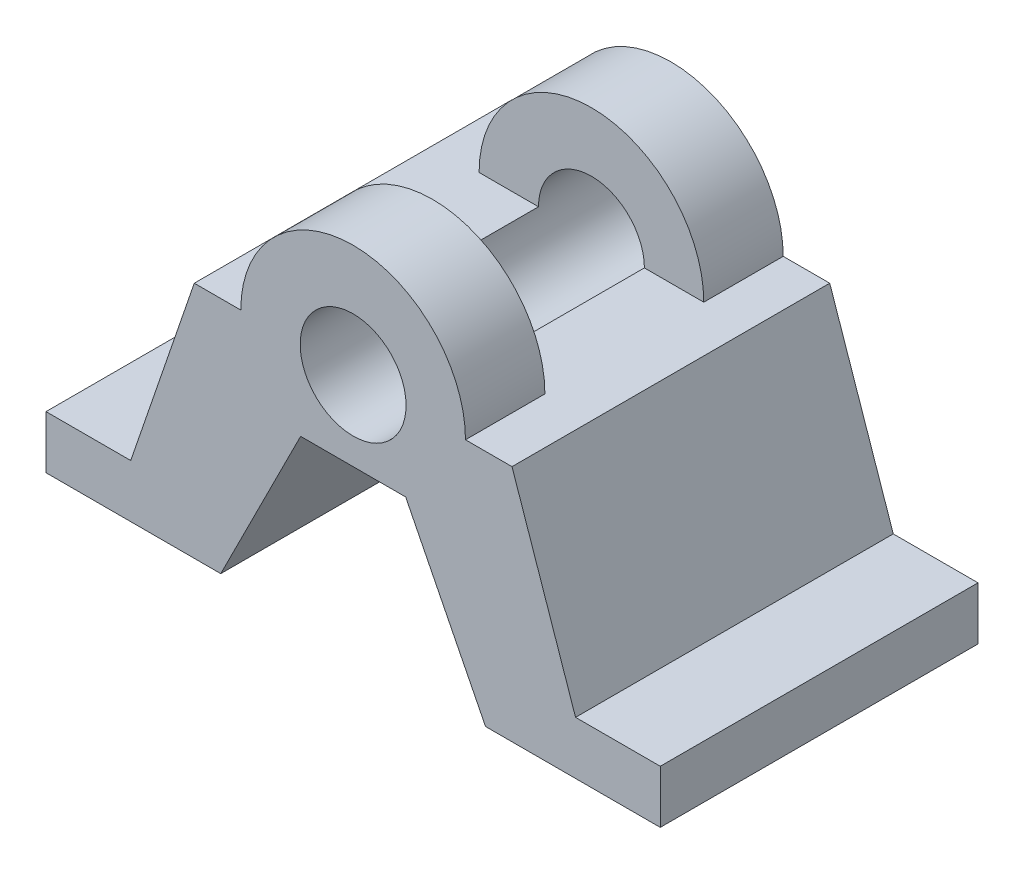
ISO-10303-21;
HEADER;
FILE_DESCRIPTION(('STEP AP214'),'2;1');
FILE_NAME('part.step','',(''),(''),'','','');
FILE_SCHEMA(('AUTOMOTIVE_DESIGN { 1 0 10303 214 1 1 1 1 }'));
ENDSEC;
DATA;
#1=APPLICATION_CONTEXT('core data for automotive mechanical design processes');
#2=APPLICATION_PROTOCOL_DEFINITION('international standard','automotive_design',2000,#1);
#3=PRODUCT_CONTEXT('',#1,'mechanical');
#4=PRODUCT('Part','Part','',(#3));
#5=PRODUCT_RELATED_PRODUCT_CATEGORY('part','',(#4));
#6=PRODUCT_DEFINITION_FORMATION('','',#4);
#7=PRODUCT_DEFINITION_CONTEXT('part definition',#1,'design');
#8=PRODUCT_DEFINITION('design','',#6,#7);
#9=PRODUCT_DEFINITION_SHAPE('','',#8);
#10=(LENGTH_UNIT() NAMED_UNIT(*) SI_UNIT(.MILLI.,.METRE.));
#11=(NAMED_UNIT(*) PLANE_ANGLE_UNIT() SI_UNIT($,.RADIAN.));
#12=(NAMED_UNIT(*) SI_UNIT($,.STERADIAN.) SOLID_ANGLE_UNIT());
#13=UNCERTAINTY_MEASURE_WITH_UNIT(LENGTH_MEASURE(1.E-05),#10,'distance_accuracy_value','');
#14=(GEOMETRIC_REPRESENTATION_CONTEXT(3) GLOBAL_UNCERTAINTY_ASSIGNED_CONTEXT((#13)) GLOBAL_UNIT_ASSIGNED_CONTEXT((#10,
#11,#12)) REPRESENTATION_CONTEXT('',''));
#15=CARTESIAN_POINT('',(0.,0.,0.));
#16=DIRECTION('',(0.,0.,1.));
#17=DIRECTION('',(1.,0.,0.));
#18=AXIS2_PLACEMENT_3D('',#15,#16,#17);
#19=CARTESIAN_POINT('',(-30.,45.,-60.));
#20=DIRECTION('',(0.,1.,0.));
#21=DIRECTION('',(0.,0.,1.));
#22=AXIS2_PLACEMENT_3D('',#19,#20,#21);
#23=PLANE('',#22);
#24=DIRECTION('',(-1.,0.,0.));
#25=VECTOR('',#24,1.);
#26=CARTESIAN_POINT('',(-30.,45.,-45.));
#27=LINE('',#26,#25);
#28=CARTESIAN_POINT('',(-10.,45.,-45.));
#29=VERTEX_POINT('',#28);
#30=CARTESIAN_POINT('',(-21.2145026831475,45.,-45.));
#31=VERTEX_POINT('',#30);
#32=EDGE_CURVE('E170',#29,#31,#27,.T.);
#33=ORIENTED_EDGE('',*,*,#32,.T.);
#34=DIRECTION('',(0.,0.,-1.));
#35=VECTOR('',#34,1.);
#36=CARTESIAN_POINT('',(-21.2145026831475,45.,-45.));
#37=LINE('',#36,#35);
#38=CARTESIAN_POINT('',(-21.2145026831475,45.,-60.));
#39=VERTEX_POINT('',#38);
#40=EDGE_CURVE('E309',#31,#39,#37,.T.);
#41=ORIENTED_EDGE('',*,*,#40,.T.);
#42=DIRECTION('',(-1.,0.,0.));
#43=VECTOR('',#42,1.);
#44=CARTESIAN_POINT('',(-30.,45.,-60.));
#45=LINE('',#44,#43);
#46=CARTESIAN_POINT('',(-30.,45.,-60.));
#47=VERTEX_POINT('',#46);
#48=EDGE_CURVE('E222',#39,#47,#45,.T.);
#49=ORIENTED_EDGE('',*,*,#48,.T.);
#50=DIRECTION('',(0.,0.,1.));
#51=VECTOR('',#50,1.);
#52=CARTESIAN_POINT('',(-30.,45.,-60.));
#53=LINE('',#52,#51);
#54=CARTESIAN_POINT('',(-30.,45.,0.));
#55=VERTEX_POINT('',#54);
#56=EDGE_CURVE('E277',#47,#55,#53,.T.);
#57=ORIENTED_EDGE('',*,*,#56,.T.);
#58=DIRECTION('',(-1.,0.,0.));
#59=VECTOR('',#58,1.);
#60=CARTESIAN_POINT('',(-30.,45.,0.));
#61=LINE('',#60,#59);
#62=CARTESIAN_POINT('',(-21.2145026831475,45.,0.));
#63=VERTEX_POINT('',#62);
#64=EDGE_CURVE('E259',#63,#55,#61,.T.);
#65=ORIENTED_EDGE('',*,*,#64,.F.);
#66=DIRECTION('',(0.,0.,1.));
#67=VECTOR('',#66,1.);
#68=CARTESIAN_POINT('',(-21.2145026831475,45.,-15.));
#69=LINE('',#68,#67);
#70=CARTESIAN_POINT('',(-21.2145026831475,45.,-15.));
#71=VERTEX_POINT('',#70);
#72=EDGE_CURVE('E194',#71,#63,#69,.T.);
#73=ORIENTED_EDGE('',*,*,#72,.F.);
#74=DIRECTION('',(1.,0.,0.));
#75=VECTOR('',#74,1.);
#76=CARTESIAN_POINT('',(-30.,45.,-15.));
#77=LINE('',#76,#75);
#78=CARTESIAN_POINT('',(-10.,45.,-15.));
#79=VERTEX_POINT('',#78);
#80=EDGE_CURVE('E181',#71,#79,#77,.T.);
#81=ORIENTED_EDGE('',*,*,#80,.T.);
#82=DIRECTION('',(0.,0.,1.));
#83=VECTOR('',#82,1.);
#84=CARTESIAN_POINT('',(-10.,45.,-60.));
#85=LINE('',#84,#83);
#86=EDGE_CURVE('E53',#29,#79,#85,.T.);
#87=ORIENTED_EDGE('',*,*,#86,.F.);
#88=EDGE_LOOP('',(#33,#41,#49,#57,#65,#73,#81,#87));
#89=FACE_BOUND('',#88,.T.);
#90=ADVANCED_FACE('F39',(#89),#23,.T.);
#91=CARTESIAN_POINT('',(30.,45.,-60.));
#92=VERTEX_POINT('',#91);
#93=CARTESIAN_POINT('',(21.2145026831475,45.,-60.));
#94=VERTEX_POINT('',#93);
#95=EDGE_CURVE('E223',#92,#94,#45,.T.);
#96=ORIENTED_EDGE('',*,*,#95,.T.);
#97=DIRECTION('',(0.,0.,-1.));
#98=VECTOR('',#97,1.);
#99=CARTESIAN_POINT('',(21.2145026831475,45.,-45.));
#100=LINE('',#99,#98);
#101=CARTESIAN_POINT('',(21.2145026831475,45.,-45.));
#102=VERTEX_POINT('',#101);
#103=EDGE_CURVE('E176',#94,#102,#100,.F.);
#104=ORIENTED_EDGE('',*,*,#103,.T.);
#105=DIRECTION('',(-1.,0.,0.));
#106=VECTOR('',#105,1.);
#107=CARTESIAN_POINT('',(-30.,45.,-45.));
#108=LINE('',#107,#106);
#109=CARTESIAN_POINT('',(10.,45.,-45.));
#110=VERTEX_POINT('',#109);
#111=EDGE_CURVE('E177',#102,#110,#108,.T.);
#112=ORIENTED_EDGE('',*,*,#111,.T.);
#113=DIRECTION('',(0.,0.,1.));
#114=VECTOR('',#113,1.);
#115=CARTESIAN_POINT('',(10.,45.,-60.));
#116=LINE('',#115,#114);
#117=CARTESIAN_POINT('',(10.,45.,-15.));
#118=VERTEX_POINT('',#117);
#119=EDGE_CURVE('E165',#118,#110,#116,.F.);
#120=ORIENTED_EDGE('',*,*,#119,.F.);
#121=CARTESIAN_POINT('',(21.2145026831475,45.,-15.));
#122=VERTEX_POINT('',#121);
#123=EDGE_CURVE('E272',#118,#122,#77,.T.);
#124=ORIENTED_EDGE('',*,*,#123,.T.);
#125=DIRECTION('',(0.,0.,1.));
#126=VECTOR('',#125,1.);
#127=CARTESIAN_POINT('',(21.2145026831475,45.,-15.));
#128=LINE('',#127,#126);
#129=CARTESIAN_POINT('',(21.2145026831475,45.,0.));
#130=VERTEX_POINT('',#129);
#131=EDGE_CURVE('E190',#130,#122,#128,.F.);
#132=ORIENTED_EDGE('',*,*,#131,.F.);
#133=CARTESIAN_POINT('',(30.,45.,0.));
#134=VERTEX_POINT('',#133);
#135=EDGE_CURVE('E260',#134,#130,#61,.T.);
#136=ORIENTED_EDGE('',*,*,#135,.F.);
#137=DIRECTION('',(0.,0.,1.));
#138=VECTOR('',#137,1.);
#139=CARTESIAN_POINT('',(30.,45.,-60.));
#140=LINE('',#139,#138);
#141=EDGE_CURVE('E280',#92,#134,#140,.T.);
#142=ORIENTED_EDGE('',*,*,#141,.F.);
#143=EDGE_LOOP('',(#96,#104,#112,#120,#124,#132,#136,#142));
#144=FACE_BOUND('',#143,.T.);
#145=ADVANCED_FACE('F300',(#144),#23,.T.);
#146=CARTESIAN_POINT('',(0.,45.,-60.));
#147=DIRECTION('',(0.,0.,1.));
#148=DIRECTION('',(1.,0.,0.));
#149=AXIS2_PLACEMENT_3D('',#146,#147,#148);
#150=CYLINDRICAL_SURFACE('',#149,10.);
#151=CARTESIAN_POINT('',(0.,45.,0.));
#152=DIRECTION('',(0.,0.,1.));
#153=DIRECTION('',(1.,0.,0.));
#154=AXIS2_PLACEMENT_3D('',#151,#152,#153);
#155=CIRCLE('',#154,10.);
#156=CARTESIAN_POINT('',(10.,45.,0.));
#157=VERTEX_POINT('',#156);
#158=EDGE_CURVE('E185',#157,#157,#155,.T.);
#159=ORIENTED_EDGE('',*,*,#158,.T.);
#160=EDGE_LOOP('',(#159));
#161=FACE_BOUND('',#160,.T.);
#162=ORIENTED_EDGE('',*,*,#119,.T.);
#163=CARTESIAN_POINT('',(0.,45.,-45.));
#164=DIRECTION('',(0.,0.,-1.));
#165=DIRECTION('',(-1.,0.,0.));
#166=AXIS2_PLACEMENT_3D('',#163,#164,#165);
#167=CIRCLE('',#166,10.);
#168=EDGE_CURVE('E11',#110,#29,#167,.F.);
#169=ORIENTED_EDGE('',*,*,#168,.T.);
#170=ORIENTED_EDGE('',*,*,#86,.T.);
#171=CARTESIAN_POINT('',(0.,45.,-15.));
#172=DIRECTION('',(0.,0.,1.));
#173=DIRECTION('',(1.,0.,0.));
#174=AXIS2_PLACEMENT_3D('',#171,#172,#173);
#175=CIRCLE('',#174,10.);
#176=EDGE_CURVE('E47',#118,#79,#175,.T.);
#177=ORIENTED_EDGE('',*,*,#176,.F.);
#178=EDGE_LOOP('',(#162,#169,#170,#177));
#179=FACE_BOUND('',#178,.T.);
#180=CARTESIAN_POINT('',(0.,45.,-60.));
#181=DIRECTION('',(0.,0.,1.));
#182=DIRECTION('',(1.,0.,0.));
#183=AXIS2_PLACEMENT_3D('',#180,#181,#182);
#184=CIRCLE('',#183,10.);
#185=CARTESIAN_POINT('',(10.,45.,-60.));
#186=VERTEX_POINT('',#185);
#187=EDGE_CURVE('E371',#186,#186,#184,.T.);
#188=ORIENTED_EDGE('',*,*,#187,.F.);
#189=EDGE_LOOP('',(#188));
#190=FACE_BOUND('',#189,.T.);
#191=ADVANCED_FACE('F162',(#161,#179,#190),#150,.F.);
#192=CARTESIAN_POINT('',(-58.,0.,-60.));
#193=DIRECTION('',(0.,-1.,0.));
#194=DIRECTION('',(0.,0.,-1.));
#195=AXIS2_PLACEMENT_3D('',#192,#193,#194);
#196=PLANE('',#195);
#197=DIRECTION('',(1.,0.,0.));
#198=VECTOR('',#197,1.);
#199=CARTESIAN_POINT('',(-58.,0.,0.));
#200=LINE('',#199,#198);
#201=CARTESIAN_POINT('',(-58.,0.,0.));
#202=VERTEX_POINT('',#201);
#203=CARTESIAN_POINT('',(-25.,0.,0.));
#204=VERTEX_POINT('',#203);
#205=EDGE_CURVE('E196',#202,#204,#200,.T.);
#206=ORIENTED_EDGE('',*,*,#205,.F.);
#207=DIRECTION('',(0.,0.,1.));
#208=VECTOR('',#207,1.);
#209=CARTESIAN_POINT('',(-58.,0.,-60.));
#210=LINE('',#209,#208);
#211=CARTESIAN_POINT('',(-58.,0.,-60.));
#212=VERTEX_POINT('',#211);
#213=EDGE_CURVE('E270',#212,#202,#210,.T.);
#214=ORIENTED_EDGE('',*,*,#213,.F.);
#215=DIRECTION('',(1.,0.,0.));
#216=VECTOR('',#215,1.);
#217=CARTESIAN_POINT('',(-58.,0.,-60.));
#218=LINE('',#217,#216);
#219=CARTESIAN_POINT('',(-25.,0.,-60.));
#220=VERTEX_POINT('',#219);
#221=EDGE_CURVE('E197',#212,#220,#218,.T.);
#222=ORIENTED_EDGE('',*,*,#221,.T.);
#223=DIRECTION('',(0.,0.,1.));
#224=VECTOR('',#223,1.);
#225=CARTESIAN_POINT('',(-25.,0.,-60.));
#226=LINE('',#225,#224);
#227=EDGE_CURVE('E235',#220,#204,#226,.T.);
#228=ORIENTED_EDGE('',*,*,#227,.T.);
#229=EDGE_LOOP('',(#206,#214,#222,#228));
#230=FACE_BOUND('',#229,.T.);
#231=ADVANCED_FACE('F41',(#230),#196,.T.);
#232=CARTESIAN_POINT('',(-58.,0.,-60.));
#233=DIRECTION('',(-1.,0.,0.));
#234=DIRECTION('',(0.,-1.,0.));
#235=AXIS2_PLACEMENT_3D('',#232,#233,#234);
#236=PLANE('',#235);
#237=DIRECTION('',(0.,-1.,0.));
#238=VECTOR('',#237,1.);
#239=CARTESIAN_POINT('',(-58.,0.,0.));
#240=LINE('',#239,#238);
#241=CARTESIAN_POINT('',(-58.,10.,0.));
#242=VERTEX_POINT('',#241);
#243=EDGE_CURVE('E201',#242,#202,#240,.T.);
#244=ORIENTED_EDGE('',*,*,#243,.F.);
#245=DIRECTION('',(0.,0.,1.));
#246=VECTOR('',#245,1.);
#247=CARTESIAN_POINT('',(-58.,10.,-60.));
#248=LINE('',#247,#246);
#249=CARTESIAN_POINT('',(-58.,10.,-60.));
#250=VERTEX_POINT('',#249);
#251=EDGE_CURVE('E273',#250,#242,#248,.T.);
#252=ORIENTED_EDGE('',*,*,#251,.F.);
#253=DIRECTION('',(0.,-1.,0.));
#254=VECTOR('',#253,1.);
#255=CARTESIAN_POINT('',(-58.,0.,-60.));
#256=LINE('',#255,#254);
#257=EDGE_CURVE('E232',#250,#212,#256,.T.);
#258=ORIENTED_EDGE('',*,*,#257,.T.);
#259=ORIENTED_EDGE('',*,*,#213,.T.);
#260=EDGE_LOOP('',(#244,#252,#258,#259));
#261=FACE_BOUND('',#260,.T.);
#262=ADVANCED_FACE('F336',(#261),#236,.T.);
#263=CARTESIAN_POINT('',(-58.,10.,-60.));
#264=DIRECTION('',(0.,1.,0.));
#265=DIRECTION('',(0.,0.,1.));
#266=AXIS2_PLACEMENT_3D('',#263,#264,#265);
#267=PLANE('',#266);
#268=DIRECTION('',(-1.,0.,0.));
#269=VECTOR('',#268,1.);
#270=CARTESIAN_POINT('',(-58.,10.,0.));
#271=LINE('',#270,#269);
#272=CARTESIAN_POINT('',(-42.,10.,0.));
#273=VERTEX_POINT('',#272);
#274=EDGE_CURVE('E265',#273,#242,#271,.T.);
#275=ORIENTED_EDGE('',*,*,#274,.F.);
#276=DIRECTION('',(0.,0.,1.));
#277=VECTOR('',#276,1.);
#278=CARTESIAN_POINT('',(-42.,10.,-60.));
#279=LINE('',#278,#277);
#280=CARTESIAN_POINT('',(-42.,10.,-60.));
#281=VERTEX_POINT('',#280);
#282=EDGE_CURVE('E275',#281,#273,#279,.T.);
#283=ORIENTED_EDGE('',*,*,#282,.F.);
#284=DIRECTION('',(-1.,0.,0.));
#285=VECTOR('',#284,1.);
#286=CARTESIAN_POINT('',(-58.,10.,-60.));
#287=LINE('',#286,#285);
#288=EDGE_CURVE('E229',#281,#250,#287,.T.);
#289=ORIENTED_EDGE('',*,*,#288,.T.);
#290=ORIENTED_EDGE('',*,*,#251,.T.);
#291=EDGE_LOOP('',(#275,#283,#289,#290));
#292=FACE_BOUND('',#291,.T.);
#293=ADVANCED_FACE('F333',(#292),#267,.T.);
#294=CARTESIAN_POINT('',(-42.,10.,-60.));
#295=DIRECTION('',(-0.945945945945946,0.324324324324324,0.));
#296=DIRECTION('',(-0.324324324324324,-0.945945945945946,0.));
#297=AXIS2_PLACEMENT_3D('',#294,#295,#296);
#298=PLANE('',#297);
#299=DIRECTION('',(-0.324324324324324,-0.945945945945946,0.));
#300=VECTOR('',#299,1.);
#301=CARTESIAN_POINT('',(-42.,10.,0.));
#302=LINE('',#301,#300);
#303=EDGE_CURVE('E262',#55,#273,#302,.T.);
#304=ORIENTED_EDGE('',*,*,#303,.F.);
#305=ORIENTED_EDGE('',*,*,#56,.F.);
#306=DIRECTION('',(-0.324324324324324,-0.945945945945946,0.));
#307=VECTOR('',#306,1.);
#308=CARTESIAN_POINT('',(-42.,10.,-60.));
#309=LINE('',#308,#307);
#310=EDGE_CURVE('E226',#47,#281,#309,.T.);
#311=ORIENTED_EDGE('',*,*,#310,.T.);
#312=ORIENTED_EDGE('',*,*,#282,.T.);
#313=EDGE_LOOP('',(#304,#305,#311,#312));
#314=FACE_BOUND('',#313,.T.);
#315=ADVANCED_FACE('F329',(#314),#298,.T.);
#316=CARTESIAN_POINT('',(42.,10.,-60.));
#317=DIRECTION('',(0.945945945945946,0.324324324324324,0.));
#318=DIRECTION('',(-0.324324324324324,0.945945945945946,0.));
#319=AXIS2_PLACEMENT_3D('',#316,#317,#318);
#320=PLANE('',#319);
#321=DIRECTION('',(-0.324324324324324,0.945945945945946,0.));
#322=VECTOR('',#321,1.);
#323=CARTESIAN_POINT('',(42.,10.,0.));
#324=LINE('',#323,#322);
#325=CARTESIAN_POINT('',(42.,10.,0.));
#326=VERTEX_POINT('',#325);
#327=EDGE_CURVE('E256',#326,#134,#324,.T.);
#328=ORIENTED_EDGE('',*,*,#327,.F.);
#329=DIRECTION('',(0.,0.,1.));
#330=VECTOR('',#329,1.);
#331=CARTESIAN_POINT('',(42.,10.,-60.));
#332=LINE('',#331,#330);
#333=CARTESIAN_POINT('',(42.,10.,-60.));
#334=VERTEX_POINT('',#333);
#335=EDGE_CURVE('E282',#334,#326,#332,.T.);
#336=ORIENTED_EDGE('',*,*,#335,.F.);
#337=DIRECTION('',(-0.324324324324324,0.945945945945946,0.));
#338=VECTOR('',#337,1.);
#339=CARTESIAN_POINT('',(42.,10.,-60.));
#340=LINE('',#339,#338);
#341=EDGE_CURVE('E219',#334,#92,#340,.T.);
#342=ORIENTED_EDGE('',*,*,#341,.T.);
#343=ORIENTED_EDGE('',*,*,#141,.T.);
#344=EDGE_LOOP('',(#328,#336,#342,#343));
#345=FACE_BOUND('',#344,.T.);
#346=ADVANCED_FACE('F366',(#345),#320,.T.);
#347=CARTESIAN_POINT('',(58.,10.,-60.));
#348=DIRECTION('',(0.,1.,0.));
#349=DIRECTION('',(0.,0.,1.));
#350=AXIS2_PLACEMENT_3D('',#347,#348,#349);
#351=PLANE('',#350);
#352=DIRECTION('',(-1.,0.,0.));
#353=VECTOR('',#352,1.);
#354=CARTESIAN_POINT('',(58.,10.,0.));
#355=LINE('',#354,#353);
#356=CARTESIAN_POINT('',(58.,10.,0.));
#357=VERTEX_POINT('',#356);
#358=EDGE_CURVE('E253',#357,#326,#355,.T.);
#359=ORIENTED_EDGE('',*,*,#358,.F.);
#360=DIRECTION('',(0.,0.,1.));
#361=VECTOR('',#360,1.);
#362=CARTESIAN_POINT('',(58.,10.,-60.));
#363=LINE('',#362,#361);
#364=CARTESIAN_POINT('',(58.,10.,-60.));
#365=VERTEX_POINT('',#364);
#366=EDGE_CURVE('E284',#365,#357,#363,.T.);
#367=ORIENTED_EDGE('',*,*,#366,.F.);
#368=DIRECTION('',(-1.,0.,0.));
#369=VECTOR('',#368,1.);
#370=CARTESIAN_POINT('',(58.,10.,-60.));
#371=LINE('',#370,#369);
#372=EDGE_CURVE('E216',#365,#334,#371,.T.);
#373=ORIENTED_EDGE('',*,*,#372,.T.);
#374=ORIENTED_EDGE('',*,*,#335,.T.);
#375=EDGE_LOOP('',(#359,#367,#373,#374));
#376=FACE_BOUND('',#375,.T.);
#377=ADVANCED_FACE('F362',(#376),#351,.T.);
#378=CARTESIAN_POINT('',(58.,10.,-60.));
#379=DIRECTION('',(1.,0.,0.));
#380=DIRECTION('',(0.,0.,-1.));
#381=AXIS2_PLACEMENT_3D('',#378,#379,#380);
#382=PLANE('',#381);
#383=DIRECTION('',(0.,1.,0.));
#384=VECTOR('',#383,1.);
#385=CARTESIAN_POINT('',(58.,10.,0.));
#386=LINE('',#385,#384);
#387=CARTESIAN_POINT('',(58.,0.,0.));
#388=VERTEX_POINT('',#387);
#389=EDGE_CURVE('E250',#388,#357,#386,.T.);
#390=ORIENTED_EDGE('',*,*,#389,.F.);
#391=DIRECTION('',(0.,0.,1.));
#392=VECTOR('',#391,1.);
#393=CARTESIAN_POINT('',(58.,0.,-60.));
#394=LINE('',#393,#392);
#395=CARTESIAN_POINT('',(58.,0.,-60.));
#396=VERTEX_POINT('',#395);
#397=EDGE_CURVE('E286',#396,#388,#394,.T.);
#398=ORIENTED_EDGE('',*,*,#397,.F.);
#399=DIRECTION('',(0.,1.,0.));
#400=VECTOR('',#399,1.);
#401=CARTESIAN_POINT('',(58.,10.,-60.));
#402=LINE('',#401,#400);
#403=EDGE_CURVE('E213',#396,#365,#402,.T.);
#404=ORIENTED_EDGE('',*,*,#403,.T.);
#405=ORIENTED_EDGE('',*,*,#366,.T.);
#406=EDGE_LOOP('',(#390,#398,#404,#405));
#407=FACE_BOUND('',#406,.T.);
#408=ADVANCED_FACE('F359',(#407),#382,.T.);
#409=CARTESIAN_POINT('',(25.,0.,-60.));
#410=DIRECTION('',(0.,-1.,0.));
#411=DIRECTION('',(0.,0.,-1.));
#412=AXIS2_PLACEMENT_3D('',#409,#410,#411);
#413=PLANE('',#412);
#414=DIRECTION('',(1.,0.,0.));
#415=VECTOR('',#414,1.);
#416=CARTESIAN_POINT('',(25.,0.,0.));
#417=LINE('',#416,#415);
#418=CARTESIAN_POINT('',(25.,0.,0.));
#419=VERTEX_POINT('',#418);
#420=EDGE_CURVE('E247',#419,#388,#417,.T.);
#421=ORIENTED_EDGE('',*,*,#420,.F.);
#422=DIRECTION('',(0.,0.,1.));
#423=VECTOR('',#422,1.);
#424=CARTESIAN_POINT('',(25.,0.,-60.));
#425=LINE('',#424,#423);
#426=CARTESIAN_POINT('',(25.,0.,-60.));
#427=VERTEX_POINT('',#426);
#428=EDGE_CURVE('E288',#427,#419,#425,.T.);
#429=ORIENTED_EDGE('',*,*,#428,.F.);
#430=DIRECTION('',(1.,0.,0.));
#431=VECTOR('',#430,1.);
#432=CARTESIAN_POINT('',(25.,0.,-60.));
#433=LINE('',#432,#431);
#434=EDGE_CURVE('E210',#427,#396,#433,.T.);
#435=ORIENTED_EDGE('',*,*,#434,.T.);
#436=ORIENTED_EDGE('',*,*,#397,.T.);
#437=EDGE_LOOP('',(#421,#429,#435,#436));
#438=FACE_BOUND('',#437,.T.);
#439=ADVANCED_FACE('F355',(#438),#413,.T.);
#440=CARTESIAN_POINT('',(25.,0.,-60.));
#441=DIRECTION('',(-0.893439880271429,-0.449182791679038,0.));
#442=DIRECTION('',(0.449182791679038,-0.893439880271429,0.));
#443=AXIS2_PLACEMENT_3D('',#440,#441,#442);
#444=PLANE('',#443);
#445=DIRECTION('',(0.449182791679038,-0.893439880271429,0.));
#446=VECTOR('',#445,1.);
#447=CARTESIAN_POINT('',(25.,0.,0.));
#448=LINE('',#447,#446);
#449=CARTESIAN_POINT('',(9.9173021622034,30.,0.));
#450=VERTEX_POINT('',#449);
#451=EDGE_CURVE('E244',#450,#419,#448,.T.);
#452=ORIENTED_EDGE('',*,*,#451,.F.);
#453=DIRECTION('',(0.,0.,1.));
#454=VECTOR('',#453,1.);
#455=CARTESIAN_POINT('',(9.9173021622034,30.,-60.));
#456=LINE('',#455,#454);
#457=CARTESIAN_POINT('',(9.9173021622034,30.,-60.));
#458=VERTEX_POINT('',#457);
#459=EDGE_CURVE('E290',#458,#450,#456,.T.);
#460=ORIENTED_EDGE('',*,*,#459,.F.);
#461=DIRECTION('',(0.449182791679038,-0.893439880271429,0.));
#462=VECTOR('',#461,1.);
#463=CARTESIAN_POINT('',(25.,0.,-60.));
#464=LINE('',#463,#462);
#465=EDGE_CURVE('E207',#458,#427,#464,.T.);
#466=ORIENTED_EDGE('',*,*,#465,.T.);
#467=ORIENTED_EDGE('',*,*,#428,.T.);
#468=EDGE_LOOP('',(#452,#460,#466,#467));
#469=FACE_BOUND('',#468,.T.);
#470=ADVANCED_FACE('F351',(#469),#444,.T.);
#471=CARTESIAN_POINT('',(-9.9173021622034,30.,-60.));
#472=DIRECTION('',(0.,-1.,0.));
#473=DIRECTION('',(0.,0.,-1.));
#474=AXIS2_PLACEMENT_3D('',#471,#472,#473);
#475=PLANE('',#474);
#476=DIRECTION('',(1.,0.,0.));
#477=VECTOR('',#476,1.);
#478=CARTESIAN_POINT('',(-9.9173021622034,30.,0.));
#479=LINE('',#478,#477);
#480=CARTESIAN_POINT('',(-9.9173021622034,30.,0.));
#481=VERTEX_POINT('',#480);
#482=EDGE_CURVE('E241',#481,#450,#479,.T.);
#483=ORIENTED_EDGE('',*,*,#482,.F.);
#484=DIRECTION('',(0.,0.,1.));
#485=VECTOR('',#484,1.);
#486=CARTESIAN_POINT('',(-9.9173021622034,30.,-60.));
#487=LINE('',#486,#485);
#488=CARTESIAN_POINT('',(-9.9173021622034,30.,-60.));
#489=VERTEX_POINT('',#488);
#490=EDGE_CURVE('E292',#489,#481,#487,.T.);
#491=ORIENTED_EDGE('',*,*,#490,.F.);
#492=DIRECTION('',(1.,0.,0.));
#493=VECTOR('',#492,1.);
#494=CARTESIAN_POINT('',(-9.9173021622034,30.,-60.));
#495=LINE('',#494,#493);
#496=EDGE_CURVE('E204',#489,#458,#495,.T.);
#497=ORIENTED_EDGE('',*,*,#496,.T.);
#498=ORIENTED_EDGE('',*,*,#459,.T.);
#499=EDGE_LOOP('',(#483,#491,#497,#498));
#500=FACE_BOUND('',#499,.T.);
#501=ADVANCED_FACE('F347',(#500),#475,.T.);
#502=CARTESIAN_POINT('',(-25.,0.,-60.));
#503=DIRECTION('',(0.893439880271429,-0.449182791679038,0.));
#504=DIRECTION('',(0.449182791679038,0.893439880271429,0.));
#505=AXIS2_PLACEMENT_3D('',#502,#503,#504);
#506=PLANE('',#505);
#507=DIRECTION('',(0.449182791679038,0.893439880271429,0.));
#508=VECTOR('',#507,1.);
#509=CARTESIAN_POINT('',(-25.,0.,0.));
#510=LINE('',#509,#508);
#511=EDGE_CURVE('E238',#204,#481,#510,.T.);
#512=ORIENTED_EDGE('',*,*,#511,.F.);
#513=ORIENTED_EDGE('',*,*,#227,.F.);
#514=DIRECTION('',(0.449182791679038,0.893439880271429,0.));
#515=VECTOR('',#514,1.);
#516=CARTESIAN_POINT('',(-25.,0.,-60.));
#517=LINE('',#516,#515);
#518=EDGE_CURVE('E200',#220,#489,#517,.T.);
#519=ORIENTED_EDGE('',*,*,#518,.T.);
#520=ORIENTED_EDGE('',*,*,#490,.T.);
#521=EDGE_LOOP('',(#512,#513,#519,#520));
#522=FACE_BOUND('',#521,.T.);
#523=ADVANCED_FACE('F343',(#522),#506,.T.);
#524=CARTESIAN_POINT('',(0.,0.,-60.));
#525=DIRECTION('',(0.,0.,-1.));
#526=DIRECTION('',(-1.,0.,0.));
#527=AXIS2_PLACEMENT_3D('',#524,#525,#526);
#528=PLANE('',#527);
#529=ORIENTED_EDGE('',*,*,#187,.T.);
#530=EDGE_LOOP('',(#529));
#531=FACE_BOUND('',#530,.T.);
#532=ORIENTED_EDGE('',*,*,#48,.F.);
#533=CARTESIAN_POINT('',(0.,45.,-60.));
#534=DIRECTION('',(0.,0.,1.));
#535=DIRECTION('',(1.,0.,0.));
#536=AXIS2_PLACEMENT_3D('',#533,#534,#535);
#537=CIRCLE('',#536,21.2145026831475);
#538=EDGE_CURVE('E304',#94,#39,#537,.T.);
#539=ORIENTED_EDGE('',*,*,#538,.F.);
#540=ORIENTED_EDGE('',*,*,#95,.F.);
#541=ORIENTED_EDGE('',*,*,#341,.F.);
#542=ORIENTED_EDGE('',*,*,#372,.F.);
#543=ORIENTED_EDGE('',*,*,#403,.F.);
#544=ORIENTED_EDGE('',*,*,#434,.F.);
#545=ORIENTED_EDGE('',*,*,#465,.F.);
#546=ORIENTED_EDGE('',*,*,#496,.F.);
#547=ORIENTED_EDGE('',*,*,#518,.F.);
#548=ORIENTED_EDGE('',*,*,#221,.F.);
#549=ORIENTED_EDGE('',*,*,#257,.F.);
#550=ORIENTED_EDGE('',*,*,#288,.F.);
#551=ORIENTED_EDGE('',*,*,#310,.F.);
#552=EDGE_LOOP('',(#532,#539,#540,#541,#542,#543,#544,#545,#546,#547,#548,#549,#550,#551));
#553=FACE_BOUND('',#552,.T.);
#554=ADVANCED_FACE('F317',(#531,#553),#528,.T.);
#555=CARTESIAN_POINT('',(0.,0.,0.));
#556=DIRECTION('',(0.,0.,-1.));
#557=DIRECTION('',(-1.,0.,0.));
#558=AXIS2_PLACEMENT_3D('',#555,#556,#557);
#559=PLANE('',#558);
#560=ORIENTED_EDGE('',*,*,#158,.F.);
#561=EDGE_LOOP('',(#560));
#562=FACE_BOUND('',#561,.T.);
#563=ORIENTED_EDGE('',*,*,#135,.T.);
#564=CARTESIAN_POINT('',(0.,45.,0.));
#565=DIRECTION('',(0.,0.,1.));
#566=DIRECTION('',(1.,0.,0.));
#567=AXIS2_PLACEMENT_3D('',#564,#565,#566);
#568=CIRCLE('',#567,21.2145026831475);
#569=EDGE_CURVE('E61',#130,#63,#568,.T.);
#570=ORIENTED_EDGE('',*,*,#569,.T.);
#571=ORIENTED_EDGE('',*,*,#64,.T.);
#572=ORIENTED_EDGE('',*,*,#303,.T.);
#573=ORIENTED_EDGE('',*,*,#274,.T.);
#574=ORIENTED_EDGE('',*,*,#243,.T.);
#575=ORIENTED_EDGE('',*,*,#205,.T.);
#576=ORIENTED_EDGE('',*,*,#511,.T.);
#577=ORIENTED_EDGE('',*,*,#482,.T.);
#578=ORIENTED_EDGE('',*,*,#451,.T.);
#579=ORIENTED_EDGE('',*,*,#420,.T.);
#580=ORIENTED_EDGE('',*,*,#389,.T.);
#581=ORIENTED_EDGE('',*,*,#358,.T.);
#582=ORIENTED_EDGE('',*,*,#327,.T.);
#583=EDGE_LOOP('',(#563,#570,#571,#572,#573,#574,#575,#576,#577,#578,#579,#580,#581,#582));
#584=FACE_BOUND('',#583,.T.);
#585=ADVANCED_FACE('F314',(#562,#584),#559,.F.);
#586=CARTESIAN_POINT('',(0.,45.,-15.));
#587=DIRECTION('',(0.,0.,1.));
#588=DIRECTION('',(1.,0.,0.));
#589=AXIS2_PLACEMENT_3D('',#586,#587,#588);
#590=CYLINDRICAL_SURFACE('',#589,21.2145026831475);
#591=CARTESIAN_POINT('',(0.,45.,-15.));
#592=DIRECTION('',(0.,0.,1.));
#593=DIRECTION('',(1.,0.,0.));
#594=AXIS2_PLACEMENT_3D('',#591,#592,#593);
#595=CIRCLE('',#594,21.2145026831475);
#596=EDGE_CURVE('E183',#122,#71,#595,.T.);
#597=ORIENTED_EDGE('',*,*,#596,.T.);
#598=ORIENTED_EDGE('',*,*,#72,.T.);
#599=ORIENTED_EDGE('',*,*,#569,.F.);
#600=ORIENTED_EDGE('',*,*,#131,.T.);
#601=EDGE_LOOP('',(#597,#598,#599,#600));
#602=FACE_BOUND('',#601,.T.);
#603=ADVANCED_FACE('F316',(#602),#590,.T.);
#604=CARTESIAN_POINT('',(0.,45.,-15.));
#605=DIRECTION('',(0.,0.,1.));
#606=DIRECTION('',(1.,0.,0.));
#607=AXIS2_PLACEMENT_3D('',#604,#605,#606);
#608=PLANE('',#607);
#609=ORIENTED_EDGE('',*,*,#123,.F.);
#610=ORIENTED_EDGE('',*,*,#176,.T.);
#611=ORIENTED_EDGE('',*,*,#80,.F.);
#612=ORIENTED_EDGE('',*,*,#596,.F.);
#613=EDGE_LOOP('',(#609,#610,#611,#612));
#614=FACE_BOUND('',#613,.T.);
#615=ADVANCED_FACE('F297',(#614),#608,.F.);
#616=CARTESIAN_POINT('',(0.,45.,-45.));
#617=DIRECTION('',(0.,0.,-1.));
#618=DIRECTION('',(-1.,0.,0.));
#619=AXIS2_PLACEMENT_3D('',#616,#617,#618);
#620=CYLINDRICAL_SURFACE('',#619,21.2145026831475);
#621=ORIENTED_EDGE('',*,*,#40,.F.);
#622=CARTESIAN_POINT('',(0.,45.,-45.));
#623=DIRECTION('',(0.,0.,1.));
#624=DIRECTION('',(1.,0.,0.));
#625=AXIS2_PLACEMENT_3D('',#622,#623,#624);
#626=CIRCLE('',#625,21.2145026831475);
#627=EDGE_CURVE('E173',#102,#31,#626,.T.);
#628=ORIENTED_EDGE('',*,*,#627,.F.);
#629=ORIENTED_EDGE('',*,*,#103,.F.);
#630=ORIENTED_EDGE('',*,*,#538,.T.);
#631=EDGE_LOOP('',(#621,#628,#629,#630));
#632=FACE_BOUND('',#631,.T.);
#633=ADVANCED_FACE('F487',(#632),#620,.T.);
#634=CARTESIAN_POINT('',(0.,45.,-45.));
#635=DIRECTION('',(0.,0.,-1.));
#636=DIRECTION('',(1.,0.,0.));
#637=AXIS2_PLACEMENT_3D('',#634,#635,#636);
#638=PLANE('',#637);
#639=ORIENTED_EDGE('',*,*,#168,.F.);
#640=ORIENTED_EDGE('',*,*,#111,.F.);
#641=ORIENTED_EDGE('',*,*,#627,.T.);
#642=ORIENTED_EDGE('',*,*,#32,.F.);
#643=EDGE_LOOP('',(#639,#640,#641,#642));
#644=FACE_BOUND('',#643,.T.);
#645=ADVANCED_FACE('F171',(#644),#638,.F.);
#646=CLOSED_SHELL('',(#90,#145,#191,#231,#262,#293,#315,#346,#377,#408,#439,#470,#501,#523,#554,
#585,#603,#615,#633,#645));
#647=MANIFOLD_SOLID_BREP('B2',#646);
#648=ADVANCED_BREP_SHAPE_REPRESENTATION('',(#18,#647),#14);
#649=SHAPE_DEFINITION_REPRESENTATION(#9,#648);
ENDSEC;
END-ISO-10303-21;
